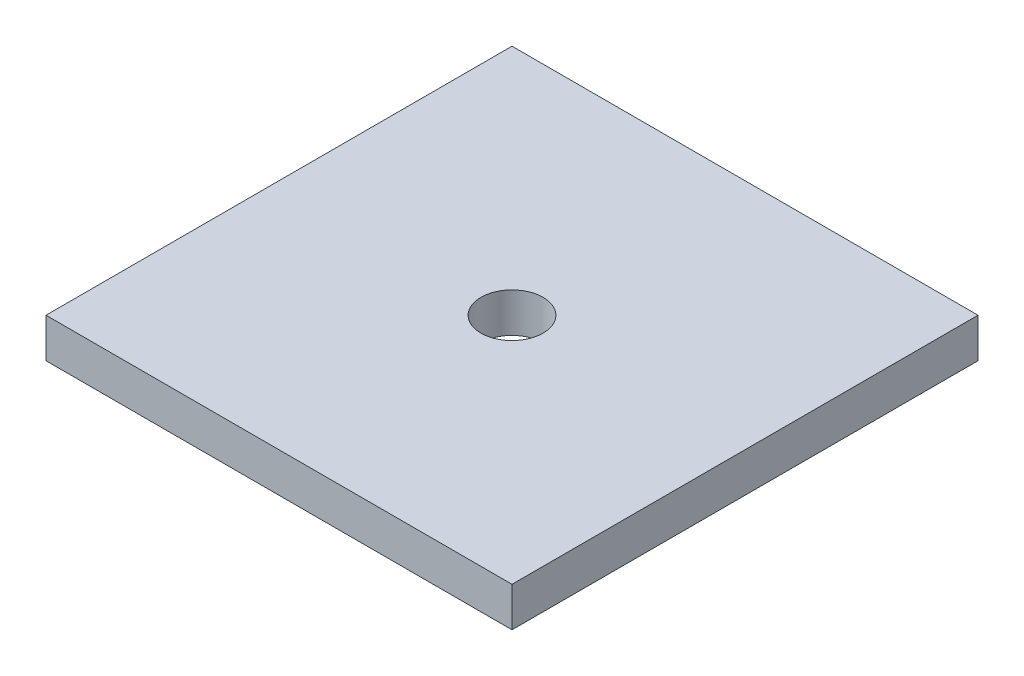
ISO-10303-21;
HEADER;
FILE_DESCRIPTION(('STEP AP214'),'2;1');
FILE_NAME('part.step','',(''),(''),'','','');
FILE_SCHEMA(('AUTOMOTIVE_DESIGN { 1 0 10303 214 1 1 1 1 }'));
ENDSEC;
DATA;
#1=APPLICATION_CONTEXT('core data for automotive mechanical design processes');
#2=APPLICATION_PROTOCOL_DEFINITION('international standard','automotive_design',2000,#1);
#3=PRODUCT_CONTEXT('',#1,'mechanical');
#4=PRODUCT('Part','Part','',(#3));
#5=PRODUCT_RELATED_PRODUCT_CATEGORY('part','',(#4));
#6=PRODUCT_DEFINITION_FORMATION('','',#4);
#7=PRODUCT_DEFINITION_CONTEXT('part definition',#1,'design');
#8=PRODUCT_DEFINITION('design','',#6,#7);
#9=PRODUCT_DEFINITION_SHAPE('','',#8);
#10=(LENGTH_UNIT() NAMED_UNIT(*) SI_UNIT(.MILLI.,.METRE.));
#11=(NAMED_UNIT(*) PLANE_ANGLE_UNIT() SI_UNIT($,.RADIAN.));
#12=(NAMED_UNIT(*) SI_UNIT($,.STERADIAN.) SOLID_ANGLE_UNIT());
#13=UNCERTAINTY_MEASURE_WITH_UNIT(LENGTH_MEASURE(1.E-05),#10,'distance_accuracy_value','');
#14=(GEOMETRIC_REPRESENTATION_CONTEXT(3) GLOBAL_UNCERTAINTY_ASSIGNED_CONTEXT((#13)) GLOBAL_UNIT_ASSIGNED_CONTEXT((#10,
#11,#12)) REPRESENTATION_CONTEXT('',''));
#15=CARTESIAN_POINT('',(0.,0.,0.));
#16=DIRECTION('',(0.,0.,1.));
#17=DIRECTION('',(1.,0.,0.));
#18=AXIS2_PLACEMENT_3D('',#15,#16,#17);
#19=CARTESIAN_POINT('',(-37.5,6.35,-37.5));
#20=DIRECTION('',(1.,0.,0.));
#21=DIRECTION('',(0.,0.,-1.));
#22=AXIS2_PLACEMENT_3D('',#19,#20,#21);
#23=PLANE('',#22);
#24=DIRECTION('',(0.,0.,1.));
#25=VECTOR('',#24,1.);
#26=CARTESIAN_POINT('',(-37.5,0.,-37.5));
#27=LINE('',#26,#25);
#28=CARTESIAN_POINT('',(-37.5,0.,-37.5));
#29=VERTEX_POINT('',#28);
#30=CARTESIAN_POINT('',(-37.5,0.,37.5));
#31=VERTEX_POINT('',#30);
#32=EDGE_CURVE('E93',#29,#31,#27,.T.);
#33=ORIENTED_EDGE('',*,*,#32,.T.);
#34=DIRECTION('',(0.,-1.,0.));
#35=VECTOR('',#34,1.);
#36=CARTESIAN_POINT('',(-37.5,6.35,37.5));
#37=LINE('',#36,#35);
#38=CARTESIAN_POINT('',(-37.5,6.35,37.5));
#39=VERTEX_POINT('',#38);
#40=EDGE_CURVE('E11',#39,#31,#37,.T.);
#41=ORIENTED_EDGE('',*,*,#40,.F.);
#42=DIRECTION('',(0.,0.,1.));
#43=VECTOR('',#42,1.);
#44=CARTESIAN_POINT('',(-37.5,6.35,-37.5));
#45=LINE('',#44,#43);
#46=CARTESIAN_POINT('',(-37.5,6.35,-37.5));
#47=VERTEX_POINT('',#46);
#48=EDGE_CURVE('E81',#47,#39,#45,.T.);
#49=ORIENTED_EDGE('',*,*,#48,.F.);
#50=DIRECTION('',(0.,-1.,0.));
#51=VECTOR('',#50,1.);
#52=CARTESIAN_POINT('',(-37.5,6.35,-37.5));
#53=LINE('',#52,#51);
#54=EDGE_CURVE('E89',#47,#29,#53,.T.);
#55=ORIENTED_EDGE('',*,*,#54,.T.);
#56=EDGE_LOOP('',(#33,#41,#49,#55));
#57=FACE_BOUND('',#56,.T.);
#58=ADVANCED_FACE('F30',(#57),#23,.F.);
#59=CARTESIAN_POINT('',(-37.5,6.35,37.5));
#60=DIRECTION('',(0.,0.,-1.));
#61=DIRECTION('',(-1.,0.,0.));
#62=AXIS2_PLACEMENT_3D('',#59,#60,#61);
#63=PLANE('',#62);
#64=DIRECTION('',(1.,0.,0.));
#65=VECTOR('',#64,1.);
#66=CARTESIAN_POINT('',(-37.5,0.,37.5));
#67=LINE('',#66,#65);
#68=CARTESIAN_POINT('',(37.5,0.,37.5));
#69=VERTEX_POINT('',#68);
#70=EDGE_CURVE('E85',#31,#69,#67,.T.);
#71=ORIENTED_EDGE('',*,*,#70,.T.);
#72=DIRECTION('',(0.,-1.,0.));
#73=VECTOR('',#72,1.);
#74=CARTESIAN_POINT('',(37.5,6.35,37.5));
#75=LINE('',#74,#73);
#76=CARTESIAN_POINT('',(37.5,6.35,37.5));
#77=VERTEX_POINT('',#76);
#78=EDGE_CURVE('E38',#77,#69,#75,.T.);
#79=ORIENTED_EDGE('',*,*,#78,.F.);
#80=DIRECTION('',(1.,0.,0.));
#81=VECTOR('',#80,1.);
#82=CARTESIAN_POINT('',(-37.5,6.35,37.5));
#83=LINE('',#82,#81);
#84=EDGE_CURVE('E76',#39,#77,#83,.T.);
#85=ORIENTED_EDGE('',*,*,#84,.F.);
#86=ORIENTED_EDGE('',*,*,#40,.T.);
#87=EDGE_LOOP('',(#71,#79,#85,#86));
#88=FACE_BOUND('',#87,.T.);
#89=ADVANCED_FACE('F84',(#88),#63,.F.);
#90=CARTESIAN_POINT('',(37.5,6.35,-37.5));
#91=DIRECTION('',(-1.,0.,0.));
#92=DIRECTION('',(0.,0.,1.));
#93=AXIS2_PLACEMENT_3D('',#90,#91,#92);
#94=PLANE('',#93);
#95=DIRECTION('',(0.,0.,-1.));
#96=VECTOR('',#95,1.);
#97=CARTESIAN_POINT('',(37.5,0.,-37.5));
#98=LINE('',#97,#96);
#99=CARTESIAN_POINT('',(37.5,0.,-37.5));
#100=VERTEX_POINT('',#99);
#101=EDGE_CURVE('E63',#69,#100,#98,.T.);
#102=ORIENTED_EDGE('',*,*,#101,.T.);
#103=DIRECTION('',(0.,-1.,0.));
#104=VECTOR('',#103,1.);
#105=CARTESIAN_POINT('',(37.5,6.35,-37.5));
#106=LINE('',#105,#104);
#107=CARTESIAN_POINT('',(37.5,6.35,-37.5));
#108=VERTEX_POINT('',#107);
#109=EDGE_CURVE('E86',#108,#100,#106,.T.);
#110=ORIENTED_EDGE('',*,*,#109,.F.);
#111=DIRECTION('',(0.,0.,-1.));
#112=VECTOR('',#111,1.);
#113=CARTESIAN_POINT('',(37.5,6.35,-37.5));
#114=LINE('',#113,#112);
#115=EDGE_CURVE('E79',#77,#108,#114,.T.);
#116=ORIENTED_EDGE('',*,*,#115,.F.);
#117=ORIENTED_EDGE('',*,*,#78,.T.);
#118=EDGE_LOOP('',(#102,#110,#116,#117));
#119=FACE_BOUND('',#118,.T.);
#120=ADVANCED_FACE('F87',(#119),#94,.F.);
#121=CARTESIAN_POINT('',(-37.5,6.35,-37.5));
#122=DIRECTION('',(0.,0.,1.));
#123=DIRECTION('',(1.,0.,0.));
#124=AXIS2_PLACEMENT_3D('',#121,#122,#123);
#125=PLANE('',#124);
#126=DIRECTION('',(-1.,0.,0.));
#127=VECTOR('',#126,1.);
#128=CARTESIAN_POINT('',(-37.5,0.,-37.5));
#129=LINE('',#128,#127);
#130=EDGE_CURVE('E69',#100,#29,#129,.T.);
#131=ORIENTED_EDGE('',*,*,#130,.T.);
#132=ORIENTED_EDGE('',*,*,#54,.F.);
#133=DIRECTION('',(-1.,0.,0.));
#134=VECTOR('',#133,1.);
#135=CARTESIAN_POINT('',(-37.5,6.35,-37.5));
#136=LINE('',#135,#134);
#137=EDGE_CURVE('E46',#108,#47,#136,.T.);
#138=ORIENTED_EDGE('',*,*,#137,.F.);
#139=ORIENTED_EDGE('',*,*,#109,.T.);
#140=EDGE_LOOP('',(#131,#132,#138,#139));
#141=FACE_BOUND('',#140,.T.);
#142=ADVANCED_FACE('F101',(#141),#125,.F.);
#143=CARTESIAN_POINT('',(-37.5,6.35,-37.5));
#144=DIRECTION('',(0.,1.,0.));
#145=DIRECTION('',(0.,0.,1.));
#146=AXIS2_PLACEMENT_3D('',#143,#144,#145);
#147=PLANE('',#146);
#148=CARTESIAN_POINT('',(0.,6.35,0.));
#149=DIRECTION('',(0.,1.,0.));
#150=DIRECTION('',(0.,0.,1.));
#151=AXIS2_PLACEMENT_3D('',#148,#149,#150);
#152=CIRCLE('',#151,4.99999999999999);
#153=CARTESIAN_POINT('',(0.,6.35,4.99999999999999));
#154=VERTEX_POINT('',#153);
#155=EDGE_CURVE('E109',#154,#154,#152,.T.);
#156=ORIENTED_EDGE('',*,*,#155,.F.);
#157=EDGE_LOOP('',(#156));
#158=FACE_BOUND('',#157,.T.);
#159=ORIENTED_EDGE('',*,*,#48,.T.);
#160=ORIENTED_EDGE('',*,*,#84,.T.);
#161=ORIENTED_EDGE('',*,*,#115,.T.);
#162=ORIENTED_EDGE('',*,*,#137,.T.);
#163=EDGE_LOOP('',(#159,#160,#161,#162));
#164=FACE_BOUND('',#163,.T.);
#165=ADVANCED_FACE('F77',(#158,#164),#147,.T.);
#166=CARTESIAN_POINT('',(-37.5,0.,-37.5));
#167=DIRECTION('',(0.,1.,0.));
#168=DIRECTION('',(0.,0.,1.));
#169=AXIS2_PLACEMENT_3D('',#166,#167,#168);
#170=PLANE('',#169);
#171=CARTESIAN_POINT('',(0.,0.,0.));
#172=DIRECTION('',(0.,1.,0.));
#173=DIRECTION('',(0.,0.,1.));
#174=AXIS2_PLACEMENT_3D('',#171,#172,#173);
#175=CIRCLE('',#174,5.);
#176=CARTESIAN_POINT('',(0.,0.,5.));
#177=VERTEX_POINT('',#176);
#178=EDGE_CURVE('E96',#177,#177,#175,.T.);
#179=ORIENTED_EDGE('',*,*,#178,.T.);
#180=EDGE_LOOP('',(#179));
#181=FACE_BOUND('',#180,.T.);
#182=ORIENTED_EDGE('',*,*,#32,.F.);
#183=ORIENTED_EDGE('',*,*,#130,.F.);
#184=ORIENTED_EDGE('',*,*,#101,.F.);
#185=ORIENTED_EDGE('',*,*,#70,.F.);
#186=EDGE_LOOP('',(#182,#183,#184,#185));
#187=FACE_BOUND('',#186,.T.);
#188=ADVANCED_FACE('F104',(#181,#187),#170,.F.);
#189=CARTESIAN_POINT('',(0.,6.35,0.));
#190=DIRECTION('',(0.,1.,0.));
#191=DIRECTION('',(0.,0.,1.));
#192=AXIS2_PLACEMENT_3D('',#189,#190,#191);
#193=CYLINDRICAL_SURFACE('',#192,4.99999999999999);
#194=ORIENTED_EDGE('',*,*,#178,.F.);
#195=EDGE_LOOP('',(#194));
#196=FACE_BOUND('',#195,.T.);
#197=ORIENTED_EDGE('',*,*,#155,.T.);
#198=EDGE_LOOP('',(#197));
#199=FACE_BOUND('',#198,.T.);
#200=ADVANCED_FACE('F113',(#196,#199),#193,.F.);
#201=CLOSED_SHELL('',(#58,#89,#120,#142,#165,#188,#200));
#202=MANIFOLD_SOLID_BREP('B2',#201);
#203=ADVANCED_BREP_SHAPE_REPRESENTATION('',(#18,#202),#14);
#204=SHAPE_DEFINITION_REPRESENTATION(#9,#203);
ENDSEC;
END-ISO-10303-21;
